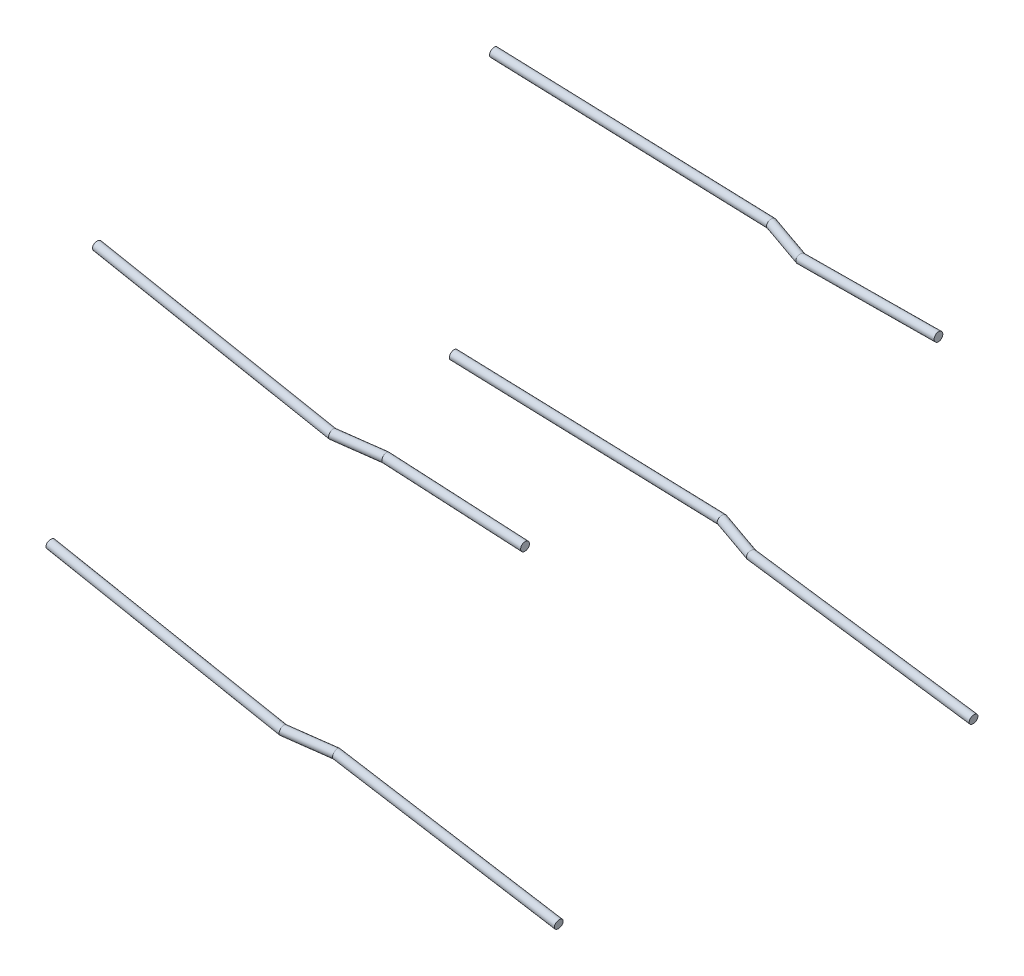
ISO-10303-21;
HEADER;
FILE_DESCRIPTION(('STEP AP214'),'2;1');
FILE_NAME('part.step','',(''),(''),'','','');
FILE_SCHEMA(('AUTOMOTIVE_DESIGN { 1 0 10303 214 1 1 1 1 }'));
ENDSEC;
DATA;
#1=APPLICATION_CONTEXT('core data for automotive mechanical design processes');
#2=APPLICATION_PROTOCOL_DEFINITION('international standard','automotive_design',2000,#1);
#3=PRODUCT_CONTEXT('',#1,'mechanical');
#4=PRODUCT('Part','Part','',(#3));
#5=PRODUCT_RELATED_PRODUCT_CATEGORY('part','',(#4));
#6=PRODUCT_DEFINITION_FORMATION('','',#4);
#7=PRODUCT_DEFINITION_CONTEXT('part definition',#1,'design');
#8=PRODUCT_DEFINITION('design','',#6,#7);
#9=PRODUCT_DEFINITION_SHAPE('','',#8);
#10=(LENGTH_UNIT() NAMED_UNIT(*) SI_UNIT(.MILLI.,.METRE.));
#11=(NAMED_UNIT(*) PLANE_ANGLE_UNIT() SI_UNIT($,.RADIAN.));
#12=(NAMED_UNIT(*) SI_UNIT($,.STERADIAN.) SOLID_ANGLE_UNIT());
#13=UNCERTAINTY_MEASURE_WITH_UNIT(LENGTH_MEASURE(1.E-05),#10,'distance_accuracy_value','');
#14=(GEOMETRIC_REPRESENTATION_CONTEXT(3) GLOBAL_UNCERTAINTY_ASSIGNED_CONTEXT((#13)) GLOBAL_UNIT_ASSIGNED_CONTEXT((#10,
#11,#12)) REPRESENTATION_CONTEXT('',''));
#15=CARTESIAN_POINT('',(0.,0.,0.));
#16=DIRECTION('',(0.,0.,1.));
#17=DIRECTION('',(1.,0.,0.));
#18=AXIS2_PLACEMENT_3D('',#15,#16,#17);
#19=CARTESIAN_POINT('',(103.000566025995,60.7524245402394,83.2545928978626));
#20=DIRECTION('',(-0.999126749782258,0.0397286644080293,-0.0129371980697272));
#21=DIRECTION('',(-0.0397319895404439,-0.999210372747981,0.));
#22=AXIS2_PLACEMENT_3D('',#19,#20,#21);
#23=PLANE('',#22);
#24=CARTESIAN_POINT('',(103.000566025995,60.7524245402394,83.2545928978626));
#25=DIRECTION('',(-0.999126749782258,0.0397286644080293,-0.0129371980697272));
#26=DIRECTION('',(-0.0397319895404439,-0.999210372747981,0.));
#27=AXIS2_PLACEMENT_3D('',#24,#25,#26);
#28=CIRCLE('',#27,0.499999999999996);
#29=CARTESIAN_POINT('',(102.980700031225,60.2528193538654,83.2545928978626));
#30=VERTEX_POINT('',#29);
#31=EDGE_CURVE('E77',#30,#30,#28,.T.);
#32=ORIENTED_EDGE('',*,*,#31,.F.);
#33=EDGE_LOOP('',(#32));
#34=FACE_BOUND('',#33,.T.);
#35=ADVANCED_FACE('F74',(#34),#23,.F.);
#36=CARTESIAN_POINT('',(52.5297250255453,64.70962198123,81.8698521668302));
#37=DIRECTION('',(-0.992306647828154,0.0906856298248,-0.0842830541647169));
#38=DIRECTION('',(-0.0916748678963236,-0.995757385852875,0.00793392183224052));
#39=AXIS2_PLACEMENT_3D('',#36,#37,#38);
#40=PLANE('',#39);
#41=CARTESIAN_POINT('',(52.5297250255453,64.70962198123,81.8698521668302));
#42=DIRECTION('',(-0.992306647828154,0.0906856298248,-0.0842830541647169));
#43=DIRECTION('',(-0.0916748678963236,-0.995757385852875,0.00793392183224052));
#44=AXIS2_PLACEMENT_3D('',#41,#42,#43);
#45=CIRCLE('',#44,0.499999999999996);
#46=CARTESIAN_POINT('',(52.4838875915971,64.2117432883036,81.8738191277463));
#47=VERTEX_POINT('',#46);
#48=EDGE_CURVE('E81',#47,#47,#45,.T.);
#49=ORIENTED_EDGE('',*,*,#48,.T.);
#50=EDGE_LOOP('',(#49));
#51=FACE_BOUND('',#50,.T.);
#52=ADVANCED_FACE('F97',(#51),#40,.T.);
#53=CARTESIAN_POINT('',(86.5314327954217,61.4072930715355,83.0413422380369));
#54=DIRECTION('',(0.999126749782258,-0.0397286644080306,0.0129371980697244));
#55=DIRECTION('',(0.0397319895404452,0.99921037274798,0.));
#56=AXIS2_PLACEMENT_3D('',#53,#54,#55);
#57=CYLINDRICAL_SURFACE('',#56,0.499999999999996);
#58=CARTESIAN_POINT('',(86.8117795658832,61.3961455341846,83.0449723096954));
#59=DIRECTION('',(0.988337817250588,-0.082495808225964,-0.127995314826316));
#60=DIRECTION('',(-0.146434735814561,-0.284291281155587,-0.947488963316109));
#61=AXIS2_PLACEMENT_3D('',#58,#59,#60);
#62=ELLIPSE('',#61,0.505511951383822,0.499999999999996);
#63=CARTESIAN_POINT('',(86.7377550568312,61.2524328938862,82.5660053149349));
#64=VERTEX_POINT('',#63);
#65=EDGE_CURVE('E86',#64,#64,#62,.T.);
#66=ORIENTED_EDGE('',*,*,#65,.T.);
#67=EDGE_LOOP('',(#66));
#68=FACE_BOUND('',#67,.T.);
#69=ORIENTED_EDGE('',*,*,#31,.T.);
#70=EDGE_LOOP('',(#69));
#71=FACE_BOUND('',#70,.T.);
#72=ADVANCED_FACE('F94',(#68,#71),#57,.T.);
#73=CARTESIAN_POINT('',(81.739036630688,62.0512747617168,84.457156821863));
#74=DIRECTION('',(0.955995803789498,-0.123463932720749,-0.266136582329448));
#75=DIRECTION('',(-0.268188476210951,0.,-0.963366462581944));
#76=AXIS2_PLACEMENT_3D('',#73,#74,#75);
#77=CYLINDRICAL_SURFACE('',#76,0.499999999999996);
#78=CARTESIAN_POINT('',(82.0318005469357,62.0134651977883,84.3756552213427));
#79=DIRECTION('',(0.989762493983238,-0.108790709026988,-0.0923839116593694));
#80=DIRECTION('',(0.102625916108439,0.0926418388841457,0.990396592800615));
#81=AXIS2_PLACEMENT_3D('',#78,#79,#80);
#82=ELLIPSE('',#81,0.50801275395483,0.499999999999996);
#83=CARTESIAN_POINT('',(82.0839358212051,62.0605284334913,84.8787893219588));
#84=VERTEX_POINT('',#83);
#85=EDGE_CURVE('E12',#84,#84,#82,.T.);
#86=ORIENTED_EDGE('',*,*,#85,.T.);
#87=EDGE_LOOP('',(#86));
#88=FACE_BOUND('',#87,.T.);
#89=ORIENTED_EDGE('',*,*,#65,.F.);
#90=EDGE_LOOP('',(#89));
#91=FACE_BOUND('',#90,.T.);
#92=ADVANCED_FACE('F104',(#88,#91),#77,.T.);
#93=CARTESIAN_POINT('',(52.5297250255453,64.70962198123,81.8698521668302));
#94=DIRECTION('',(0.992306647828153,-0.0906856298248013,0.0842830541647141));
#95=DIRECTION('',(0.09100945482654,0.995850028434089,0.));
#96=AXIS2_PLACEMENT_3D('',#93,#94,#95);
#97=CYLINDRICAL_SURFACE('',#96,0.499999999999996);
#98=ORIENTED_EDGE('',*,*,#48,.F.);
#99=EDGE_LOOP('',(#98));
#100=FACE_BOUND('',#99,.T.);
#101=ORIENTED_EDGE('',*,*,#85,.F.);
#102=EDGE_LOOP('',(#101));
#103=FACE_BOUND('',#102,.T.);
#104=ADVANCED_FACE('F102',(#100,#103),#97,.T.);
#105=CLOSED_SHELL('',(#35,#52,#72,#92,#104));
#106=MANIFOLD_SOLID_BREP('B2',#105);
#107=CARTESIAN_POINT('',(109.559212295801,27.8433209087015,85.9436607657857));
#108=DIRECTION('',(-0.989160017945112,0.146152983308051,-0.0142043785144945));
#109=DIRECTION('',(-0.146167729771798,-0.989259821671414,0.));
#110=AXIS2_PLACEMENT_3D('',#107,#108,#109);
#111=PLANE('',#110);
#112=CARTESIAN_POINT('',(109.559212295801,27.8433209087015,85.9436607657857));
#113=DIRECTION('',(-0.989160017945112,0.146152983308051,-0.0142043785144945));
#114=DIRECTION('',(-0.146167729771798,-0.989259821671414,0.));
#115=AXIS2_PLACEMENT_3D('',#112,#113,#114);
#116=CIRCLE('',#115,0.499999999999997);
#117=CARTESIAN_POINT('',(109.486128430915,27.3486909978658,85.9436607657857));
#118=VERTEX_POINT('',#117);
#119=EDGE_CURVE('E176',#118,#118,#116,.T.);
#120=ORIENTED_EDGE('',*,*,#119,.F.);
#121=EDGE_LOOP('',(#120));
#122=FACE_BOUND('',#121,.T.);
#123=ADVANCED_FACE('F173',(#122),#111,.F.);
#124=CARTESIAN_POINT('',(49.7355064763849,34.947362939481,84.3997295218339));
#125=DIRECTION('',(-0.992239780168551,0.0905914394165903,-0.0851669522496601));
#126=DIRECTION('',(-0.0904250199449642,-0.995886274149323,-0.00581762227479492));
#127=AXIS2_PLACEMENT_3D('',#124,#125,#126);
#128=PLANE('',#127);
#129=CARTESIAN_POINT('',(49.7355064763849,34.947362939481,84.3997295218339));
#130=DIRECTION('',(-0.992239780168551,0.0905914394165903,-0.0851669522496601));
#131=DIRECTION('',(-0.0904250199449642,-0.995886274149323,-0.00581762227479492));
#132=AXIS2_PLACEMENT_3D('',#129,#130,#131);
#133=CIRCLE('',#132,0.499999999999997);
#134=CARTESIAN_POINT('',(49.6902939664124,34.4494198024064,84.3968207106965));
#135=VERTEX_POINT('',#134);
#136=EDGE_CURVE('E180',#135,#135,#133,.T.);
#137=ORIENTED_EDGE('',*,*,#136,.T.);
#138=EDGE_LOOP('',(#137));
#139=FACE_BOUND('',#138,.T.);
#140=ADVANCED_FACE('F196',(#139),#128,.T.);
#141=CARTESIAN_POINT('',(83.41678846654,31.7059853555393,85.5682544850825));
#142=DIRECTION('',(0.989160017945112,-0.146152983308051,0.0142043785144949));
#143=DIRECTION('',(0.146167729771797,0.989259821671414,0.));
#144=AXIS2_PLACEMENT_3D('',#141,#142,#143);
#145=CYLINDRICAL_SURFACE('',#144,0.499999999999997);
#146=CARTESIAN_POINT('',(83.6759256678537,31.6676966313986,85.5719757059444));
#147=DIRECTION('',(0.982477830846986,-0.136180680159294,-0.127248317260202));
#148=DIRECTION('',(-0.117102740954796,0.0801149697372,-0.989883093948413));
#149=AXIS2_PLACEMENT_3D('',#146,#147,#148);
#150=ELLIPSE('',#149,0.505089525409254,0.499999999999997);
#151=CARTESIAN_POINT('',(83.6167783000007,31.7081618634413,85.0719961238114));
#152=VERTEX_POINT('',#151);
#153=EDGE_CURVE('E185',#152,#152,#150,.T.);
#154=ORIENTED_EDGE('',*,*,#153,.T.);
#155=EDGE_LOOP('',(#154));
#156=FACE_BOUND('',#155,.T.);
#157=ORIENTED_EDGE('',*,*,#119,.T.);
#158=EDGE_LOOP('',(#157));
#159=FACE_BOUND('',#158,.T.);
#160=ADVANCED_FACE('F193',(#156,#159),#145,.T.);
#161=CARTESIAN_POINT('',(78.6016446880276,32.3230244926884,86.9845883893863));
#162=DIRECTION('',(0.955995803789498,-0.123463932720749,-0.266136582329446));
#163=DIRECTION('',(-0.268188476210949,0.,-0.963366462581945));
#164=AXIS2_PLACEMENT_3D('',#161,#162,#163);
#165=CYLINDRICAL_SURFACE('',#164,0.499999999999997);
#166=CARTESIAN_POINT('',(78.8959466489062,32.2850162950023,86.9026586175917));
#167=DIRECTION('',(0.989807918291959,-0.108751582220887,-0.0919422549810053));
#168=DIRECTION('',(0.10218355763159,0.0926782502810852,0.990438924151605));
#169=AXIS2_PLACEMENT_3D('',#166,#167,#168);
#170=ELLIPSE('',#169,0.508053505665395,0.499999999999997);
#171=CARTESIAN_POINT('',(78.9478613635823,32.3321018049565,87.4058545851544));
#172=VERTEX_POINT('',#171);
#173=EDGE_CURVE('E73',#172,#172,#170,.T.);
#174=ORIENTED_EDGE('',*,*,#173,.T.);
#175=EDGE_LOOP('',(#174));
#176=FACE_BOUND('',#175,.T.);
#177=ORIENTED_EDGE('',*,*,#153,.F.);
#178=EDGE_LOOP('',(#177));
#179=FACE_BOUND('',#178,.T.);
#180=ADVANCED_FACE('F203',(#176,#179),#165,.T.);
#181=CARTESIAN_POINT('',(49.7355064763849,34.947362939481,84.3997295218339));
#182=DIRECTION('',(0.992239780168551,-0.0905914394165901,0.0851669522496603));
#183=DIRECTION('',(0.0909217860265156,0.995858036481982,0.));
#184=AXIS2_PLACEMENT_3D('',#181,#182,#183);
#185=CYLINDRICAL_SURFACE('',#184,0.499999999999997);
#186=ORIENTED_EDGE('',*,*,#136,.F.);
#187=EDGE_LOOP('',(#186));
#188=FACE_BOUND('',#187,.T.);
#189=ORIENTED_EDGE('',*,*,#173,.F.);
#190=EDGE_LOOP('',(#189));
#191=FACE_BOUND('',#190,.T.);
#192=ADVANCED_FACE('F201',(#188,#191),#185,.T.);
#193=CLOSED_SHELL('',(#123,#140,#160,#180,#192));
#194=MANIFOLD_SOLID_BREP('B7',#193);
#195=CARTESIAN_POINT('',(109.35543650239,24.2131926844335,38.1557141272074));
#196=DIRECTION('',(-0.991282839546647,0.131541171978118,-0.00743317529461437));
#197=DIRECTION('',(-0.131544806091376,-0.991310225908309,0.));
#198=AXIS2_PLACEMENT_3D('',#195,#196,#197);
#199=PLANE('',#198);
#200=CARTESIAN_POINT('',(109.35543650239,24.2131926844335,38.1557141272074));
#201=DIRECTION('',(-0.991282839546647,0.131541171978118,-0.00743317529461437));
#202=DIRECTION('',(-0.131544806091376,-0.991310225908309,0.));
#203=AXIS2_PLACEMENT_3D('',#200,#201,#202);
#204=CIRCLE('',#203,0.500000000000001);
#205=CARTESIAN_POINT('',(109.289664099345,23.7175375714794,38.1557141272074));
#206=VERTEX_POINT('',#205);
#207=EDGE_CURVE('E274',#206,#206,#204,.T.);
#208=ORIENTED_EDGE('',*,*,#207,.F.);
#209=EDGE_LOOP('',(#208));
#210=FACE_BOUND('',#209,.T.);
#211=ADVANCED_FACE('F271',(#210),#199,.F.);
#212=CARTESIAN_POINT('',(50.0941460413748,31.0221711855786,38.5674949787298));
#213=DIRECTION('',(-0.992145646744615,0.103944834061288,0.0695879811295064));
#214=DIRECTION('',(-0.103849948278174,-0.994580459602098,0.00498975152691621));
#215=AXIS2_PLACEMENT_3D('',#212,#213,#214);
#216=PLANE('',#215);
#217=CARTESIAN_POINT('',(50.0941460413748,31.0221711855786,38.5674949787298));
#218=DIRECTION('',(-0.992145646744615,0.103944834061288,0.0695879811295064));
#219=DIRECTION('',(-0.103849948278174,-0.994580459602098,0.00498975152691621));
#220=AXIS2_PLACEMENT_3D('',#217,#218,#219);
#221=CIRCLE('',#220,0.500000000000001);
#222=CARTESIAN_POINT('',(50.0422210672357,30.5248809557775,38.5699898544932));
#223=VERTEX_POINT('',#222);
#224=EDGE_CURVE('E278',#223,#223,#221,.T.);
#225=ORIENTED_EDGE('',*,*,#224,.T.);
#226=EDGE_LOOP('',(#225));
#227=FACE_BOUND('',#226,.T.);
#228=ADVANCED_FACE('F294',(#227),#216,.T.);
#229=CARTESIAN_POINT('',(83.4094102922203,27.6561764219727,37.9611567785631));
#230=DIRECTION('',(0.991282839546647,-0.131541171978118,0.00743317529461468));
#231=DIRECTION('',(0.131544806091375,0.991310225908309,0.));
#232=AXIS2_PLACEMENT_3D('',#229,#230,#231);
#233=CYLINDRICAL_SURFACE('',#232,0.500000000000001);
#234=CARTESIAN_POINT('',(83.6759256678537,27.6208103856988,37.9631552551096));
#235=DIRECTION('',(0.983557930317182,-0.10521783786359,0.146775353194916));
#236=DIRECTION('',(-0.124549632412635,0.193312712216279,0.97319966315318));
#237=AXIS2_PLACEMENT_3D('',#234,#235,#236);
#238=ELLIPSE('',#237,0.505093574400898,0.500000000000001);
#239=CARTESIAN_POINT('',(83.6130164488281,27.7184513944893,38.4547121515774));
#240=VERTEX_POINT('',#239);
#241=EDGE_CURVE('E283',#240,#240,#238,.T.);
#242=ORIENTED_EDGE('',*,*,#241,.T.);
#243=EDGE_LOOP('',(#242));
#244=FACE_BOUND('',#243,.T.);
#245=ORIENTED_EDGE('',*,*,#207,.T.);
#246=EDGE_LOOP('',(#245));
#247=FACE_BOUND('',#246,.T.);
#248=ADVANCED_FACE('F291',(#244,#247),#233,.T.);
#249=CARTESIAN_POINT('',(78.6048476708074,28.0280493489826,36.4611481748344));
#250=DIRECTION('',(0.955995803789498,-0.0767723825714356,0.283157243261015));
#251=DIRECTION('',(0.283995414436592,0.,-0.958825638257023));
#252=AXIS2_PLACEMENT_3D('',#249,#250,#251);
#253=CYLINDRICAL_SURFACE('',#252,0.500000000000001);
#254=CARTESIAN_POINT('',(78.8959466489062,28.004672298556,36.5473690388045));
#255=DIRECTION('',(0.989845170876942,-0.0918219075566508,0.108513939124219));
#256=DIRECTION('',(0.101649487360835,-0.076406023885355,-0.99188179801492));
#257=AXIS2_PLACEMENT_3D('',#254,#255,#256);
#258=ELLIPSE('',#257,0.508097176724803,0.500000000000001);
#259=CARTESIAN_POINT('',(78.9475944664498,27.9658506135351,36.0433966975884));
#260=VERTEX_POINT('',#259);
#261=EDGE_CURVE('E172',#260,#260,#258,.T.);
#262=ORIENTED_EDGE('',*,*,#261,.T.);
#263=EDGE_LOOP('',(#262));
#264=FACE_BOUND('',#263,.T.);
#265=ORIENTED_EDGE('',*,*,#241,.F.);
#266=EDGE_LOOP('',(#265));
#267=FACE_BOUND('',#266,.T.);
#268=ADVANCED_FACE('F301',(#264,#267),#253,.T.);
#269=CARTESIAN_POINT('',(50.0941460413748,31.0221711855786,38.5674949787298));
#270=DIRECTION('',(0.992145646744615,-0.103944834061287,-0.0695879811295064));
#271=DIRECTION('',(0.104197427577972,0.994556632920485,0.));
#272=AXIS2_PLACEMENT_3D('',#269,#270,#271);
#273=CYLINDRICAL_SURFACE('',#272,0.500000000000001);
#274=ORIENTED_EDGE('',*,*,#224,.F.);
#275=EDGE_LOOP('',(#274));
#276=FACE_BOUND('',#275,.T.);
#277=ORIENTED_EDGE('',*,*,#261,.F.);
#278=EDGE_LOOP('',(#277));
#279=FACE_BOUND('',#278,.T.);
#280=ADVANCED_FACE('F299',(#276,#279),#273,.T.);
#281=CLOSED_SHELL('',(#211,#228,#248,#268,#280));
#282=MANIFOLD_SOLID_BREP('B68',#281);
#283=CARTESIAN_POINT('',(102.481405378342,57.3492592884849,35.30782310078));
#284=DIRECTION('',(-0.999966466499575,0.,0.00818937582198537));
#285=DIRECTION('',(0.00818937582198537,0.,0.999966466499575));
#286=AXIS2_PLACEMENT_3D('',#283,#284,#285);
#287=PLANE('',#286);
#288=CARTESIAN_POINT('',(102.481405378342,57.3492592884849,35.30782310078));
#289=DIRECTION('',(-0.999966466499575,0.,0.00818937582198537));
#290=DIRECTION('',(0.00818937582198537,0.,0.999966466499575));
#291=AXIS2_PLACEMENT_3D('',#288,#289,#290);
#292=CIRCLE('',#291,0.500000000000002);
#293=CARTESIAN_POINT('',(102.485500066253,57.3492592884849,35.8078063340298));
#294=VERTEX_POINT('',#293);
#295=EDGE_CURVE('E365',#294,#294,#292,.T.);
#296=ORIENTED_EDGE('',*,*,#295,.F.);
#297=EDGE_LOOP('',(#296));
#298=FACE_BOUND('',#297,.T.);
#299=ADVANCED_FACE('F362',(#298),#287,.F.);
#300=CARTESIAN_POINT('',(52.1710854605555,60.8426503670642,36.0326687449155));
#301=DIRECTION('',(-0.9923949685878,0.103342505020826,0.0668771483964434));
#302=DIRECTION('',(0.0650710277530519,-0.0207544325828072,0.997664780813339));
#303=AXIS2_PLACEMENT_3D('',#300,#301,#302);
#304=PLANE('',#303);
#305=CARTESIAN_POINT('',(52.1710854605555,60.8426503670642,36.0326687449155));
#306=DIRECTION('',(-0.9923949685878,0.103342505020826,0.0668771483964434));
#307=DIRECTION('',(0.0650710277530519,-0.0207544325828072,0.997664780813339));
#308=AXIS2_PLACEMENT_3D('',#305,#306,#307);
#309=CIRCLE('',#308,0.500000000000002);
#310=CARTESIAN_POINT('',(52.203620974432,60.8322731507728,36.5315011353222));
#311=VERTEX_POINT('',#310);
#312=EDGE_CURVE('E369',#311,#311,#309,.T.);
#313=ORIENTED_EDGE('',*,*,#312,.T.);
#314=EDGE_LOOP('',(#313));
#315=FACE_BOUND('',#314,.T.);
#316=ADVANCED_FACE('F385',(#315),#304,.T.);
#317=CARTESIAN_POINT('',(86.5866431647967,57.3492592884849,35.4379956472889));
#318=DIRECTION('',(0.999966466499575,0.,-0.00818937582198444));
#319=DIRECTION('',(-0.00818937582198444,0.,-0.999966466499575));
#320=AXIS2_PLACEMENT_3D('',#317,#318,#319);
#321=CYLINDRICAL_SURFACE('',#320,0.500000000000002);
#322=CARTESIAN_POINT('',(86.8117795658832,57.3492592884849,35.4361518588605));
#323=DIRECTION('',(0.989515645316665,-0.0388389259019005,0.139105447443047));
#324=DIRECTION('',(-0.144410604995417,-0.252139620618897,0.956854842115049));
#325=AXIS2_PLACEMENT_3D('',#322,#323,#324);
#326=ELLIPSE('',#325,0.505897102591058,0.500000000000002);
#327=CARTESIAN_POINT('',(86.7387226592326,57.2217025849654,35.9202219510867));
#328=VERTEX_POINT('',#327);
#329=EDGE_CURVE('E374',#328,#328,#326,.T.);
#330=ORIENTED_EDGE('',*,*,#329,.T.);
#331=EDGE_LOOP('',(#330));
#332=FACE_BOUND('',#331,.T.);
#333=ORIENTED_EDGE('',*,*,#295,.T.);
#334=EDGE_LOOP('',(#333));
#335=FACE_BOUND('',#334,.T.);
#336=ADVANCED_FACE('F382',(#332,#335),#321,.T.);
#337=CARTESIAN_POINT('',(81.8273235695659,57.7495419687465,33.9598014256489));
#338=DIRECTION('',(0.955995803789498,-0.076772382571434,0.283157243261014));
#339=DIRECTION('',(0.283995414436592,0.,-0.958825638257023));
#340=AXIS2_PLACEMENT_3D('',#337,#338,#339);
#341=CYLINDRICAL_SURFACE('',#340,0.500000000000002);
#342=CARTESIAN_POINT('',(82.0318005469357,57.733121201342,34.0203656425554));
#343=DIRECTION('',(0.989726667414012,-0.0914932004275668,0.109864089151438));
#344=DIRECTION('',(0.103136153405123,-0.0752857995538766,-0.991813985708171));
#345=AXIS2_PLACEMENT_3D('',#342,#343,#344);
#346=ELLIPSE('',#345,0.507971337908985,0.500000000000002);
#347=CARTESIAN_POINT('',(82.0841907567677,57.6948781730171,33.5165525652784));
#348=VERTEX_POINT('',#347);
#349=EDGE_CURVE('E270',#348,#348,#346,.T.);
#350=ORIENTED_EDGE('',*,*,#349,.T.);
#351=EDGE_LOOP('',(#350));
#352=FACE_BOUND('',#351,.T.);
#353=ORIENTED_EDGE('',*,*,#329,.F.);
#354=EDGE_LOOP('',(#353));
#355=FACE_BOUND('',#354,.T.);
#356=ADVANCED_FACE('F392',(#352,#355),#341,.T.);
#357=CARTESIAN_POINT('',(52.1710854605555,60.8426503670642,36.0326687449155));
#358=DIRECTION('',(0.9923949685878,-0.103342505020827,-0.0668771483964426));
#359=DIRECTION('',(0.103574385549116,0.99462171032917,0.));
#360=AXIS2_PLACEMENT_3D('',#357,#358,#359);
#361=CYLINDRICAL_SURFACE('',#360,0.500000000000002);
#362=ORIENTED_EDGE('',*,*,#312,.F.);
#363=EDGE_LOOP('',(#362));
#364=FACE_BOUND('',#363,.T.);
#365=ORIENTED_EDGE('',*,*,#349,.F.);
#366=EDGE_LOOP('',(#365));
#367=FACE_BOUND('',#366,.T.);
#368=ADVANCED_FACE('F390',(#364,#367),#361,.T.);
#369=CLOSED_SHELL('',(#299,#316,#336,#356,#368));
#370=MANIFOLD_SOLID_BREP('B167',#369);
#371=ADVANCED_BREP_SHAPE_REPRESENTATION('',(#18,#106,#194,#282,#370),#14);
#372=SHAPE_DEFINITION_REPRESENTATION(#9,#371);
ENDSEC;
END-ISO-10303-21;
